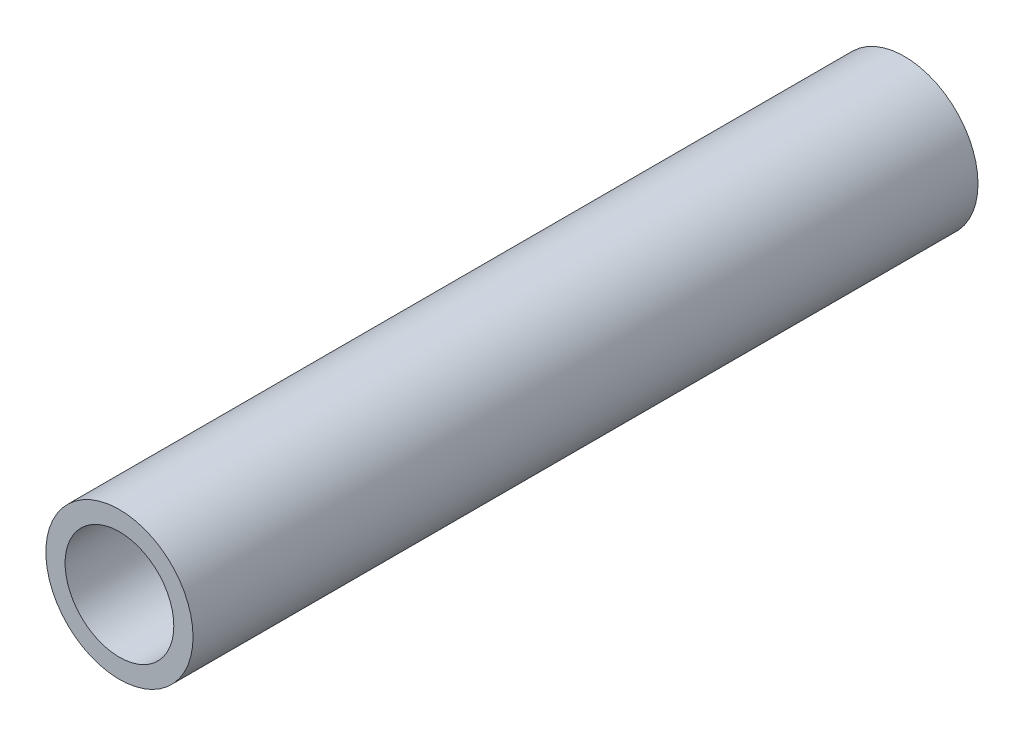
ISO-10303-21;
HEADER;
FILE_DESCRIPTION(('STEP AP214'),'2;1');
FILE_NAME('part.step','',(''),(''),'','','');
FILE_SCHEMA(('AUTOMOTIVE_DESIGN { 1 0 10303 214 1 1 1 1 }'));
ENDSEC;
DATA;
#1=APPLICATION_CONTEXT('core data for automotive mechanical design processes');
#2=APPLICATION_PROTOCOL_DEFINITION('international standard','automotive_design',2000,#1);
#3=PRODUCT_CONTEXT('',#1,'mechanical');
#4=PRODUCT('Part','Part','',(#3));
#5=PRODUCT_RELATED_PRODUCT_CATEGORY('part','',(#4));
#6=PRODUCT_DEFINITION_FORMATION('','',#4);
#7=PRODUCT_DEFINITION_CONTEXT('part definition',#1,'design');
#8=PRODUCT_DEFINITION('design','',#6,#7);
#9=PRODUCT_DEFINITION_SHAPE('','',#8);
#10=(LENGTH_UNIT() NAMED_UNIT(*) SI_UNIT(.MILLI.,.METRE.));
#11=(NAMED_UNIT(*) PLANE_ANGLE_UNIT() SI_UNIT($,.RADIAN.));
#12=(NAMED_UNIT(*) SI_UNIT($,.STERADIAN.) SOLID_ANGLE_UNIT());
#13=UNCERTAINTY_MEASURE_WITH_UNIT(LENGTH_MEASURE(1.E-05),#10,'distance_accuracy_value','');
#14=(GEOMETRIC_REPRESENTATION_CONTEXT(3) GLOBAL_UNCERTAINTY_ASSIGNED_CONTEXT((#13)) GLOBAL_UNIT_ASSIGNED_CONTEXT((#10,
#11,#12)) REPRESENTATION_CONTEXT('',''));
#15=CARTESIAN_POINT('',(0.,0.,0.));
#16=DIRECTION('',(0.,0.,1.));
#17=DIRECTION('',(1.,0.,0.));
#18=AXIS2_PLACEMENT_3D('',#15,#16,#17);
#19=CARTESIAN_POINT('',(0.,0.,-50.8));
#20=DIRECTION('',(0.,0.,-1.));
#21=DIRECTION('',(1.,0.,0.));
#22=AXIS2_PLACEMENT_3D('',#19,#20,#21);
#23=PLANE('',#22);
#24=CARTESIAN_POINT('',(0.,0.,-50.8));
#25=DIRECTION('',(0.,0.,1.));
#26=DIRECTION('',(1.,0.,0.));
#27=AXIS2_PLACEMENT_3D('',#24,#25,#26);
#28=CIRCLE('',#27,4.7625);
#29=CARTESIAN_POINT('',(4.7625,0.,-50.8));
#30=VERTEX_POINT('',#29);
#31=EDGE_CURVE('E10',#30,#30,#28,.T.);
#32=ORIENTED_EDGE('',*,*,#31,.F.);
#33=EDGE_LOOP('',(#32));
#34=FACE_BOUND('',#33,.T.);
#35=CARTESIAN_POINT('',(0.,0.,-50.8));
#36=DIRECTION('',(0.,0.,1.));
#37=DIRECTION('',(1.,0.,0.));
#38=AXIS2_PLACEMENT_3D('',#35,#36,#37);
#39=CIRCLE('',#38,3.5179);
#40=CARTESIAN_POINT('',(3.5179,0.,-50.8));
#41=VERTEX_POINT('',#40);
#42=EDGE_CURVE('E52',#41,#41,#39,.T.);
#43=ORIENTED_EDGE('',*,*,#42,.T.);
#44=EDGE_LOOP('',(#43));
#45=FACE_BOUND('',#44,.T.);
#46=ADVANCED_FACE('F41',(#34,#45),#23,.T.);
#47=CARTESIAN_POINT('',(0.,0.,0.));
#48=DIRECTION('',(0.,0.,-1.));
#49=DIRECTION('',(1.,0.,0.));
#50=AXIS2_PLACEMENT_3D('',#47,#48,#49);
#51=PLANE('',#50);
#52=CARTESIAN_POINT('',(0.,0.,0.));
#53=DIRECTION('',(0.,0.,1.));
#54=DIRECTION('',(1.,0.,0.));
#55=AXIS2_PLACEMENT_3D('',#52,#53,#54);
#56=CIRCLE('',#55,4.7625);
#57=CARTESIAN_POINT('',(4.7625,0.,0.));
#58=VERTEX_POINT('',#57);
#59=EDGE_CURVE('E45',#58,#58,#56,.T.);
#60=ORIENTED_EDGE('',*,*,#59,.T.);
#61=EDGE_LOOP('',(#60));
#62=FACE_BOUND('',#61,.T.);
#63=CARTESIAN_POINT('',(0.,0.,0.));
#64=DIRECTION('',(0.,0.,1.));
#65=DIRECTION('',(1.,0.,0.));
#66=AXIS2_PLACEMENT_3D('',#63,#64,#65);
#67=CIRCLE('',#66,3.5179);
#68=CARTESIAN_POINT('',(3.5179,0.,0.));
#69=VERTEX_POINT('',#68);
#70=EDGE_CURVE('E54',#69,#69,#67,.T.);
#71=ORIENTED_EDGE('',*,*,#70,.F.);
#72=EDGE_LOOP('',(#71));
#73=FACE_BOUND('',#72,.T.);
#74=ADVANCED_FACE('F67',(#62,#73),#51,.F.);
#75=CARTESIAN_POINT('',(0.,0.,-50.8));
#76=DIRECTION('',(0.,0.,1.));
#77=DIRECTION('',(-1.,0.,0.));
#78=AXIS2_PLACEMENT_3D('',#75,#76,#77);
#79=CYLINDRICAL_SURFACE('',#78,4.7625);
#80=ORIENTED_EDGE('',*,*,#31,.T.);
#81=EDGE_LOOP('',(#80));
#82=FACE_BOUND('',#81,.T.);
#83=ORIENTED_EDGE('',*,*,#59,.F.);
#84=EDGE_LOOP('',(#83));
#85=FACE_BOUND('',#84,.T.);
#86=ADVANCED_FACE('F43',(#82,#85),#79,.T.);
#87=CARTESIAN_POINT('',(0.,0.,-50.8));
#88=DIRECTION('',(0.,0.,1.));
#89=DIRECTION('',(-1.,0.,0.));
#90=AXIS2_PLACEMENT_3D('',#87,#88,#89);
#91=CYLINDRICAL_SURFACE('',#90,3.5179);
#92=ORIENTED_EDGE('',*,*,#42,.F.);
#93=EDGE_LOOP('',(#92));
#94=FACE_BOUND('',#93,.T.);
#95=ORIENTED_EDGE('',*,*,#70,.T.);
#96=EDGE_LOOP('',(#95));
#97=FACE_BOUND('',#96,.T.);
#98=ADVANCED_FACE('F61',(#94,#97),#91,.F.);
#99=CLOSED_SHELL('',(#46,#74,#86,#98));
#100=MANIFOLD_SOLID_BREP('B2',#99);
#101=ADVANCED_BREP_SHAPE_REPRESENTATION('',(#18,#100),#14);
#102=SHAPE_DEFINITION_REPRESENTATION(#9,#101);
ENDSEC;
END-ISO-10303-21;
